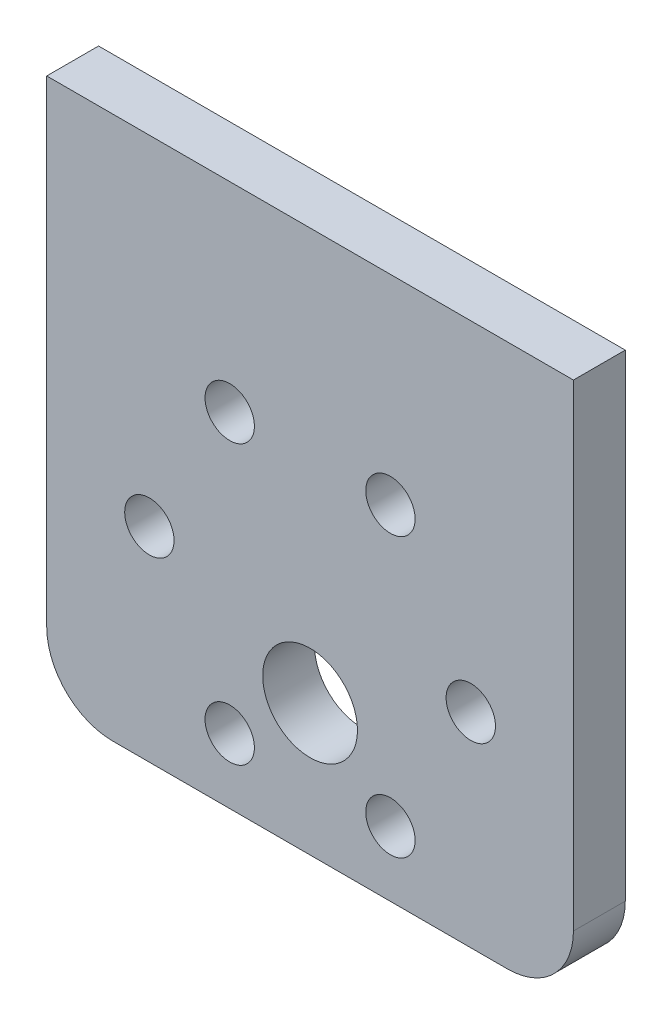
ISO-10303-21;
HEADER;
FILE_DESCRIPTION(('STEP AP214'),'2;1');
FILE_NAME('part.step','',(''),(''),'','','');
FILE_SCHEMA(('AUTOMOTIVE_DESIGN { 1 0 10303 214 1 1 1 1 }'));
ENDSEC;
DATA;
#1=APPLICATION_CONTEXT('core data for automotive mechanical design processes');
#2=APPLICATION_PROTOCOL_DEFINITION('international standard','automotive_design',2000,#1);
#3=PRODUCT_CONTEXT('',#1,'mechanical');
#4=PRODUCT('Part','Part','',(#3));
#5=PRODUCT_RELATED_PRODUCT_CATEGORY('part','',(#4));
#6=PRODUCT_DEFINITION_FORMATION('','',#4);
#7=PRODUCT_DEFINITION_CONTEXT('part definition',#1,'design');
#8=PRODUCT_DEFINITION('design','',#6,#7);
#9=PRODUCT_DEFINITION_SHAPE('','',#8);
#10=(LENGTH_UNIT() NAMED_UNIT(*) SI_UNIT(.MILLI.,.METRE.));
#11=(NAMED_UNIT(*) PLANE_ANGLE_UNIT() SI_UNIT($,.RADIAN.));
#12=(NAMED_UNIT(*) SI_UNIT($,.STERADIAN.) SOLID_ANGLE_UNIT());
#13=UNCERTAINTY_MEASURE_WITH_UNIT(LENGTH_MEASURE(1.E-05),#10,'distance_accuracy_value','');
#14=(GEOMETRIC_REPRESENTATION_CONTEXT(3) GLOBAL_UNCERTAINTY_ASSIGNED_CONTEXT((#13)) GLOBAL_UNIT_ASSIGNED_CONTEXT((#10,
#11,#12)) REPRESENTATION_CONTEXT('',''));
#15=CARTESIAN_POINT('',(0.,0.,0.));
#16=DIRECTION('',(0.,0.,1.));
#17=DIRECTION('',(1.,0.,0.));
#18=AXIS2_PLACEMENT_3D('',#15,#16,#17);
#19=CARTESIAN_POINT('',(0.,0.,-2.5));
#20=DIRECTION('',(0.,0.,-1.));
#21=DIRECTION('',(-1.,0.,0.));
#22=AXIS2_PLACEMENT_3D('',#19,#20,#21);
#23=PLANE('',#22);
#24=CARTESIAN_POINT('',(-15.5,-6.48740000000015,-2.5));
#25=DIRECTION('',(0.,0.,-1.));
#26=DIRECTION('',(-1.,0.,0.));
#27=AXIS2_PLACEMENT_3D('',#24,#25,#26);
#28=CIRCLE('',#27,2.38125);
#29=CARTESIAN_POINT('',(-17.88125,-6.48740000000015,-2.5));
#30=VERTEX_POINT('',#29);
#31=EDGE_CURVE('E209',#30,#30,#28,.T.);
#32=ORIENTED_EDGE('',*,*,#31,.F.);
#33=EDGE_LOOP('',(#32));
#34=FACE_BOUND('',#33,.T.);
#35=CARTESIAN_POINT('',(-7.75000000000013,6.93599375865875,-2.5));
#36=DIRECTION('',(0.,0.,-1.));
#37=DIRECTION('',(-1.,0.,0.));
#38=AXIS2_PLACEMENT_3D('',#35,#36,#37);
#39=CIRCLE('',#38,2.38125);
#40=CARTESIAN_POINT('',(-10.1312500000001,6.93599375865875,-2.5));
#41=VERTEX_POINT('',#40);
#42=EDGE_CURVE('E202',#41,#41,#39,.T.);
#43=ORIENTED_EDGE('',*,*,#42,.F.);
#44=EDGE_LOOP('',(#43));
#45=FACE_BOUND('',#44,.T.);
#46=CARTESIAN_POINT('',(7.75,6.93599375865881,-2.5));
#47=DIRECTION('',(0.,0.,-1.));
#48=DIRECTION('',(-1.,0.,0.));
#49=AXIS2_PLACEMENT_3D('',#46,#47,#48);
#50=CIRCLE('',#49,2.38125);
#51=CARTESIAN_POINT('',(5.36875,6.93599375865881,-2.5));
#52=VERTEX_POINT('',#51);
#53=EDGE_CURVE('E192',#52,#52,#50,.T.);
#54=ORIENTED_EDGE('',*,*,#53,.F.);
#55=EDGE_LOOP('',(#54));
#56=FACE_BOUND('',#55,.T.);
#57=CARTESIAN_POINT('',(15.5,-6.48739999999993,-2.5));
#58=DIRECTION('',(0.,0.,-1.));
#59=DIRECTION('',(-1.,0.,0.));
#60=AXIS2_PLACEMENT_3D('',#57,#58,#59);
#61=CIRCLE('',#60,2.38125);
#62=CARTESIAN_POINT('',(13.11875,-6.48739999999993,-2.5));
#63=VERTEX_POINT('',#62);
#64=EDGE_CURVE('E184',#63,#63,#61,.T.);
#65=ORIENTED_EDGE('',*,*,#64,.F.);
#66=EDGE_LOOP('',(#65));
#67=FACE_BOUND('',#66,.T.);
#68=CARTESIAN_POINT('',(-7.75000000000003,-19.9107937586588,-2.5));
#69=DIRECTION('',(0.,0.,-1.));
#70=DIRECTION('',(-1.,0.,0.));
#71=AXIS2_PLACEMENT_3D('',#68,#69,#70);
#72=CIRCLE('',#71,2.38125);
#73=CARTESIAN_POINT('',(-10.13125,-19.9107937586588,-2.5));
#74=VERTEX_POINT('',#73);
#75=EDGE_CURVE('E177',#74,#74,#72,.T.);
#76=ORIENTED_EDGE('',*,*,#75,.F.);
#77=EDGE_LOOP('',(#76));
#78=FACE_BOUND('',#77,.T.);
#79=CARTESIAN_POINT('',(7.75,-19.9107937586588,-2.5));
#80=DIRECTION('',(0.,0.,-1.));
#81=DIRECTION('',(-1.,0.,0.));
#82=AXIS2_PLACEMENT_3D('',#79,#80,#81);
#83=CIRCLE('',#82,2.38125);
#84=CARTESIAN_POINT('',(5.36875,-19.9107937586588,-2.5));
#85=VERTEX_POINT('',#84);
#86=EDGE_CURVE('E166',#85,#85,#83,.T.);
#87=ORIENTED_EDGE('',*,*,#86,.F.);
#88=EDGE_LOOP('',(#87));
#89=FACE_BOUND('',#88,.T.);
#90=DIRECTION('',(0.,1.,0.));
#91=VECTOR('',#90,1.);
#92=CARTESIAN_POINT('',(25.4,-26.1874,-2.5));
#93=LINE('',#92,#91);
#94=CARTESIAN_POINT('',(25.4,-19.8374,-2.5));
#95=VERTEX_POINT('',#94);
#96=CARTESIAN_POINT('',(25.4,26.1874,-2.5));
#97=VERTEX_POINT('',#96);
#98=EDGE_CURVE('E118',#95,#97,#93,.T.);
#99=ORIENTED_EDGE('',*,*,#98,.F.);
#100=CARTESIAN_POINT('',(19.05,-19.8374,-2.5));
#101=DIRECTION('',(0.,0.,-1.));
#102=DIRECTION('',(-1.,0.,0.));
#103=AXIS2_PLACEMENT_3D('',#100,#101,#102);
#104=CIRCLE('',#103,6.35);
#105=CARTESIAN_POINT('',(19.05,-26.1874,-2.5));
#106=VERTEX_POINT('',#105);
#107=EDGE_CURVE('E129',#95,#106,#104,.T.);
#108=ORIENTED_EDGE('',*,*,#107,.T.);
#109=DIRECTION('',(1.,0.,0.));
#110=VECTOR('',#109,1.);
#111=CARTESIAN_POINT('',(-25.4,-26.1874,-2.5));
#112=LINE('',#111,#110);
#113=CARTESIAN_POINT('',(-19.05,-26.1874,-2.5));
#114=VERTEX_POINT('',#113);
#115=EDGE_CURVE('E105',#114,#106,#112,.T.);
#116=ORIENTED_EDGE('',*,*,#115,.F.);
#117=CARTESIAN_POINT('',(-19.05,-19.8374,-2.5));
#118=DIRECTION('',(0.,0.,-1.));
#119=DIRECTION('',(-1.,0.,0.));
#120=AXIS2_PLACEMENT_3D('',#117,#118,#119);
#121=CIRCLE('',#120,6.35);
#122=CARTESIAN_POINT('',(-25.4,-19.8374,-2.5));
#123=VERTEX_POINT('',#122);
#124=EDGE_CURVE('E122',#114,#123,#121,.T.);
#125=ORIENTED_EDGE('',*,*,#124,.T.);
#126=DIRECTION('',(0.,-1.,0.));
#127=VECTOR('',#126,1.);
#128=CARTESIAN_POINT('',(-25.4,-26.1874,-2.5));
#129=LINE('',#128,#127);
#130=CARTESIAN_POINT('',(-25.4,26.1874,-2.5));
#131=VERTEX_POINT('',#130);
#132=EDGE_CURVE('E270',#131,#123,#129,.T.);
#133=ORIENTED_EDGE('',*,*,#132,.F.);
#134=DIRECTION('',(-1.,0.,0.));
#135=VECTOR('',#134,1.);
#136=CARTESIAN_POINT('',(-25.4,26.1874,-2.5));
#137=LINE('',#136,#135);
#138=EDGE_CURVE('E271',#97,#131,#137,.T.);
#139=ORIENTED_EDGE('',*,*,#138,.F.);
#140=EDGE_LOOP('',(#99,#108,#116,#125,#133,#139));
#141=FACE_BOUND('',#140,.T.);
#142=CARTESIAN_POINT('',(0.,-13.4874,-2.5));
#143=DIRECTION('',(0.,0.,1.));
#144=DIRECTION('',(1.,0.,0.));
#145=AXIS2_PLACEMENT_3D('',#142,#143,#144);
#146=CIRCLE('',#145,4.572);
#147=CARTESIAN_POINT('',(4.572,-13.4874,-2.5));
#148=VERTEX_POINT('',#147);
#149=EDGE_CURVE('E155',#148,#148,#146,.T.);
#150=ORIENTED_EDGE('',*,*,#149,.T.);
#151=EDGE_LOOP('',(#150));
#152=FACE_BOUND('',#151,.T.);
#153=ADVANCED_FACE('F40',(#34,#45,#56,#67,#78,#89,#141,#152),#23,.T.);
#154=CARTESIAN_POINT('',(25.4,-26.1874,2.5));
#155=DIRECTION('',(-1.,0.,0.));
#156=DIRECTION('',(0.,0.,1.));
#157=AXIS2_PLACEMENT_3D('',#154,#155,#156);
#158=PLANE('',#157);
#159=DIRECTION('',(0.,1.,0.));
#160=VECTOR('',#159,1.);
#161=CARTESIAN_POINT('',(25.4,-26.1874,2.5));
#162=LINE('',#161,#160);
#163=CARTESIAN_POINT('',(25.4,-19.8374,2.5));
#164=VERTEX_POINT('',#163);
#165=CARTESIAN_POINT('',(25.4,26.1874,2.5));
#166=VERTEX_POINT('',#165);
#167=EDGE_CURVE('E94',#164,#166,#162,.T.);
#168=ORIENTED_EDGE('',*,*,#167,.F.);
#169=DIRECTION('',(0.,0.,-1.));
#170=VECTOR('',#169,1.);
#171=CARTESIAN_POINT('',(25.4,-19.8374,2.5));
#172=LINE('',#171,#170);
#173=EDGE_CURVE('E120',#164,#95,#172,.T.);
#174=ORIENTED_EDGE('',*,*,#173,.T.);
#175=ORIENTED_EDGE('',*,*,#98,.T.);
#176=DIRECTION('',(0.,0.,-1.));
#177=VECTOR('',#176,1.);
#178=CARTESIAN_POINT('',(25.4,26.1874,2.5));
#179=LINE('',#178,#177);
#180=EDGE_CURVE('E110',#166,#97,#179,.T.);
#181=ORIENTED_EDGE('',*,*,#180,.F.);
#182=EDGE_LOOP('',(#168,#174,#175,#181));
#183=FACE_BOUND('',#182,.T.);
#184=ADVANCED_FACE('F116',(#183),#158,.F.);
#185=CARTESIAN_POINT('',(-25.4,26.1874,2.5));
#186=DIRECTION('',(0.,-1.,0.));
#187=DIRECTION('',(0.,0.,-1.));
#188=AXIS2_PLACEMENT_3D('',#185,#186,#187);
#189=PLANE('',#188);
#190=ORIENTED_EDGE('',*,*,#138,.T.);
#191=DIRECTION('',(0.,0.,-1.));
#192=VECTOR('',#191,1.);
#193=CARTESIAN_POINT('',(-25.4,26.1874,2.5));
#194=LINE('',#193,#192);
#195=CARTESIAN_POINT('',(-25.4,26.1874,2.5));
#196=VERTEX_POINT('',#195);
#197=EDGE_CURVE('E112',#196,#131,#194,.T.);
#198=ORIENTED_EDGE('',*,*,#197,.F.);
#199=DIRECTION('',(-1.,0.,0.));
#200=VECTOR('',#199,1.);
#201=CARTESIAN_POINT('',(-25.4,26.1874,2.5));
#202=LINE('',#201,#200);
#203=EDGE_CURVE('E97',#166,#196,#202,.T.);
#204=ORIENTED_EDGE('',*,*,#203,.F.);
#205=ORIENTED_EDGE('',*,*,#180,.T.);
#206=EDGE_LOOP('',(#190,#198,#204,#205));
#207=FACE_BOUND('',#206,.T.);
#208=ADVANCED_FACE('F109',(#207),#189,.F.);
#209=CARTESIAN_POINT('',(-25.4,-26.1874,2.5));
#210=DIRECTION('',(1.,0.,0.));
#211=DIRECTION('',(0.,0.,-1.));
#212=AXIS2_PLACEMENT_3D('',#209,#210,#211);
#213=PLANE('',#212);
#214=ORIENTED_EDGE('',*,*,#132,.T.);
#215=DIRECTION('',(0.,0.,-1.));
#216=VECTOR('',#215,1.);
#217=CARTESIAN_POINT('',(-25.4,-19.8374,2.5));
#218=LINE('',#217,#216);
#219=CARTESIAN_POINT('',(-25.4,-19.8374,2.5));
#220=VERTEX_POINT('',#219);
#221=EDGE_CURVE('E12',#123,#220,#218,.F.);
#222=ORIENTED_EDGE('',*,*,#221,.T.);
#223=DIRECTION('',(0.,-1.,0.));
#224=VECTOR('',#223,1.);
#225=CARTESIAN_POINT('',(-25.4,-26.1874,2.5));
#226=LINE('',#225,#224);
#227=EDGE_CURVE('E114',#196,#220,#226,.T.);
#228=ORIENTED_EDGE('',*,*,#227,.F.);
#229=ORIENTED_EDGE('',*,*,#197,.T.);
#230=EDGE_LOOP('',(#214,#222,#228,#229));
#231=FACE_BOUND('',#230,.T.);
#232=ADVANCED_FACE('F247',(#231),#213,.F.);
#233=CARTESIAN_POINT('',(-25.4,-26.1874,2.5));
#234=DIRECTION('',(0.,1.,0.));
#235=DIRECTION('',(0.,0.,1.));
#236=AXIS2_PLACEMENT_3D('',#233,#234,#235);
#237=PLANE('',#236);
#238=ORIENTED_EDGE('',*,*,#115,.T.);
#239=DIRECTION('',(0.,0.,-1.));
#240=VECTOR('',#239,1.);
#241=CARTESIAN_POINT('',(19.05,-26.1874,2.5));
#242=LINE('',#241,#240);
#243=CARTESIAN_POINT('',(19.05,-26.1874,2.5));
#244=VERTEX_POINT('',#243);
#245=EDGE_CURVE('E61',#106,#244,#242,.F.);
#246=ORIENTED_EDGE('',*,*,#245,.T.);
#247=DIRECTION('',(1.,0.,0.));
#248=VECTOR('',#247,1.);
#249=CARTESIAN_POINT('',(-25.4,-26.1874,2.5));
#250=LINE('',#249,#248);
#251=CARTESIAN_POINT('',(-19.05,-26.1874,2.5));
#252=VERTEX_POINT('',#251);
#253=EDGE_CURVE('E124',#252,#244,#250,.T.);
#254=ORIENTED_EDGE('',*,*,#253,.F.);
#255=DIRECTION('',(0.,0.,-1.));
#256=VECTOR('',#255,1.);
#257=CARTESIAN_POINT('',(-19.05,-26.1874,2.5));
#258=LINE('',#257,#256);
#259=EDGE_CURVE('E131',#252,#114,#258,.T.);
#260=ORIENTED_EDGE('',*,*,#259,.T.);
#261=EDGE_LOOP('',(#238,#246,#254,#260));
#262=FACE_BOUND('',#261,.T.);
#263=ADVANCED_FACE('F241',(#262),#237,.F.);
#264=CARTESIAN_POINT('',(0.,0.,2.5));
#265=DIRECTION('',(0.,0.,-1.));
#266=DIRECTION('',(-1.,0.,0.));
#267=AXIS2_PLACEMENT_3D('',#264,#265,#266);
#268=PLANE('',#267);
#269=CARTESIAN_POINT('',(-15.5,-6.48740000000015,2.5));
#270=DIRECTION('',(0.,0.,-1.));
#271=DIRECTION('',(-1.,0.,0.));
#272=AXIS2_PLACEMENT_3D('',#269,#270,#271);
#273=CIRCLE('',#272,2.38125);
#274=CARTESIAN_POINT('',(-17.88125,-6.48740000000015,2.5));
#275=VERTEX_POINT('',#274);
#276=EDGE_CURVE('E204',#275,#275,#273,.T.);
#277=ORIENTED_EDGE('',*,*,#276,.T.);
#278=EDGE_LOOP('',(#277));
#279=FACE_BOUND('',#278,.T.);
#280=CARTESIAN_POINT('',(-7.75000000000013,6.93599375865875,2.5));
#281=DIRECTION('',(0.,0.,-1.));
#282=DIRECTION('',(-1.,0.,0.));
#283=AXIS2_PLACEMENT_3D('',#280,#281,#282);
#284=CIRCLE('',#283,2.38125);
#285=CARTESIAN_POINT('',(-10.1312500000001,6.93599375865875,2.5));
#286=VERTEX_POINT('',#285);
#287=EDGE_CURVE('E197',#286,#286,#284,.T.);
#288=ORIENTED_EDGE('',*,*,#287,.T.);
#289=EDGE_LOOP('',(#288));
#290=FACE_BOUND('',#289,.T.);
#291=CARTESIAN_POINT('',(7.75,6.93599375865881,2.5));
#292=DIRECTION('',(0.,0.,-1.));
#293=DIRECTION('',(-1.,0.,0.));
#294=AXIS2_PLACEMENT_3D('',#291,#292,#293);
#295=CIRCLE('',#294,2.38125);
#296=CARTESIAN_POINT('',(5.36875,6.93599375865881,2.5));
#297=VERTEX_POINT('',#296);
#298=EDGE_CURVE('E187',#297,#297,#295,.T.);
#299=ORIENTED_EDGE('',*,*,#298,.T.);
#300=EDGE_LOOP('',(#299));
#301=FACE_BOUND('',#300,.T.);
#302=CARTESIAN_POINT('',(15.5,-6.48739999999993,2.5));
#303=DIRECTION('',(0.,0.,-1.));
#304=DIRECTION('',(-1.,0.,0.));
#305=AXIS2_PLACEMENT_3D('',#302,#303,#304);
#306=CIRCLE('',#305,2.38125);
#307=CARTESIAN_POINT('',(13.11875,-6.48739999999993,2.5));
#308=VERTEX_POINT('',#307);
#309=EDGE_CURVE('E179',#308,#308,#306,.T.);
#310=ORIENTED_EDGE('',*,*,#309,.T.);
#311=EDGE_LOOP('',(#310));
#312=FACE_BOUND('',#311,.T.);
#313=CARTESIAN_POINT('',(-7.75000000000003,-19.9107937586588,2.5));
#314=DIRECTION('',(0.,0.,-1.));
#315=DIRECTION('',(-1.,0.,0.));
#316=AXIS2_PLACEMENT_3D('',#313,#314,#315);
#317=CIRCLE('',#316,2.38125);
#318=CARTESIAN_POINT('',(-10.13125,-19.9107937586588,2.5));
#319=VERTEX_POINT('',#318);
#320=EDGE_CURVE('E172',#319,#319,#317,.T.);
#321=ORIENTED_EDGE('',*,*,#320,.T.);
#322=EDGE_LOOP('',(#321));
#323=FACE_BOUND('',#322,.T.);
#324=CARTESIAN_POINT('',(7.75,-19.9107937586588,2.5));
#325=DIRECTION('',(0.,0.,-1.));
#326=DIRECTION('',(-1.,0.,0.));
#327=AXIS2_PLACEMENT_3D('',#324,#325,#326);
#328=CIRCLE('',#327,2.38125);
#329=CARTESIAN_POINT('',(5.36875,-19.9107937586588,2.5));
#330=VERTEX_POINT('',#329);
#331=EDGE_CURVE('E161',#330,#330,#328,.T.);
#332=ORIENTED_EDGE('',*,*,#331,.T.);
#333=EDGE_LOOP('',(#332));
#334=FACE_BOUND('',#333,.T.);
#335=CARTESIAN_POINT('',(0.,-13.4874,2.5));
#336=DIRECTION('',(0.,0.,1.));
#337=DIRECTION('',(1.,0.,0.));
#338=AXIS2_PLACEMENT_3D('',#335,#336,#337);
#339=CIRCLE('',#338,4.572);
#340=CARTESIAN_POINT('',(4.572,-13.4874,2.5));
#341=VERTEX_POINT('',#340);
#342=EDGE_CURVE('E157',#341,#341,#339,.T.);
#343=ORIENTED_EDGE('',*,*,#342,.F.);
#344=EDGE_LOOP('',(#343));
#345=FACE_BOUND('',#344,.T.);
#346=ORIENTED_EDGE('',*,*,#253,.T.);
#347=CARTESIAN_POINT('',(19.05,-19.8374,2.5));
#348=DIRECTION('',(0.,0.,-1.));
#349=DIRECTION('',(-1.,0.,0.));
#350=AXIS2_PLACEMENT_3D('',#347,#348,#349);
#351=CIRCLE('',#350,6.35);
#352=EDGE_CURVE('E48',#244,#164,#351,.F.);
#353=ORIENTED_EDGE('',*,*,#352,.T.);
#354=ORIENTED_EDGE('',*,*,#167,.T.);
#355=ORIENTED_EDGE('',*,*,#203,.T.);
#356=ORIENTED_EDGE('',*,*,#227,.T.);
#357=CARTESIAN_POINT('',(-19.05,-19.8374,2.5));
#358=DIRECTION('',(0.,0.,-1.));
#359=DIRECTION('',(-1.,0.,0.));
#360=AXIS2_PLACEMENT_3D('',#357,#358,#359);
#361=CIRCLE('',#360,6.35);
#362=EDGE_CURVE('E135',#220,#252,#361,.F.);
#363=ORIENTED_EDGE('',*,*,#362,.T.);
#364=EDGE_LOOP('',(#346,#353,#354,#355,#356,#363));
#365=FACE_BOUND('',#364,.T.);
#366=ADVANCED_FACE('F96',(#279,#290,#301,#312,#323,#334,#345,#365),#268,.F.);
#367=CARTESIAN_POINT('',(0.,-13.4874,2.5));
#368=DIRECTION('',(0.,0.,1.));
#369=DIRECTION('',(1.,0.,0.));
#370=AXIS2_PLACEMENT_3D('',#367,#368,#369);
#371=CYLINDRICAL_SURFACE('',#370,4.572);
#372=ORIENTED_EDGE('',*,*,#149,.F.);
#373=EDGE_LOOP('',(#372));
#374=FACE_BOUND('',#373,.T.);
#375=ORIENTED_EDGE('',*,*,#342,.T.);
#376=EDGE_LOOP('',(#375));
#377=FACE_BOUND('',#376,.T.);
#378=ADVANCED_FACE('F233',(#374,#377),#371,.F.);
#379=CARTESIAN_POINT('',(7.75,-19.9107937586588,-2.5));
#380=DIRECTION('',(0.,0.,-1.));
#381=DIRECTION('',(-1.,0.,0.));
#382=AXIS2_PLACEMENT_3D('',#379,#380,#381);
#383=CYLINDRICAL_SURFACE('',#382,2.38125);
#384=ORIENTED_EDGE('',*,*,#331,.F.);
#385=EDGE_LOOP('',(#384));
#386=FACE_BOUND('',#385,.T.);
#387=ORIENTED_EDGE('',*,*,#86,.T.);
#388=EDGE_LOOP('',(#387));
#389=FACE_BOUND('',#388,.T.);
#390=ADVANCED_FACE('F236',(#386,#389),#383,.F.);
#391=CARTESIAN_POINT('',(-7.75000000000003,-19.9107937586588,-2.5));
#392=DIRECTION('',(0.,0.,-1.));
#393=DIRECTION('',(-1.,0.,0.));
#394=AXIS2_PLACEMENT_3D('',#391,#392,#393);
#395=CYLINDRICAL_SURFACE('',#394,2.38125);
#396=ORIENTED_EDGE('',*,*,#320,.F.);
#397=EDGE_LOOP('',(#396));
#398=FACE_BOUND('',#397,.T.);
#399=ORIENTED_EDGE('',*,*,#75,.T.);
#400=EDGE_LOOP('',(#399));
#401=FACE_BOUND('',#400,.T.);
#402=ADVANCED_FACE('F288',(#398,#401),#395,.F.);
#403=CARTESIAN_POINT('',(15.5,-6.48739999999993,-2.5));
#404=DIRECTION('',(0.,0.,-1.));
#405=DIRECTION('',(-1.,0.,0.));
#406=AXIS2_PLACEMENT_3D('',#403,#404,#405);
#407=CYLINDRICAL_SURFACE('',#406,2.38125);
#408=ORIENTED_EDGE('',*,*,#309,.F.);
#409=EDGE_LOOP('',(#408));
#410=FACE_BOUND('',#409,.T.);
#411=ORIENTED_EDGE('',*,*,#64,.T.);
#412=EDGE_LOOP('',(#411));
#413=FACE_BOUND('',#412,.T.);
#414=ADVANCED_FACE('F284',(#410,#413),#407,.F.);
#415=CARTESIAN_POINT('',(7.75,6.93599375865881,-2.5));
#416=DIRECTION('',(0.,0.,-1.));
#417=DIRECTION('',(-1.,0.,0.));
#418=AXIS2_PLACEMENT_3D('',#415,#416,#417);
#419=CYLINDRICAL_SURFACE('',#418,2.38125);
#420=ORIENTED_EDGE('',*,*,#298,.F.);
#421=EDGE_LOOP('',(#420));
#422=FACE_BOUND('',#421,.T.);
#423=ORIENTED_EDGE('',*,*,#53,.T.);
#424=EDGE_LOOP('',(#423));
#425=FACE_BOUND('',#424,.T.);
#426=ADVANCED_FACE('F277',(#422,#425),#419,.F.);
#427=CARTESIAN_POINT('',(-7.75000000000013,6.93599375865875,-2.5));
#428=DIRECTION('',(0.,0.,-1.));
#429=DIRECTION('',(-1.,0.,0.));
#430=AXIS2_PLACEMENT_3D('',#427,#428,#429);
#431=CYLINDRICAL_SURFACE('',#430,2.38125);
#432=ORIENTED_EDGE('',*,*,#287,.F.);
#433=EDGE_LOOP('',(#432));
#434=FACE_BOUND('',#433,.T.);
#435=ORIENTED_EDGE('',*,*,#42,.T.);
#436=EDGE_LOOP('',(#435));
#437=FACE_BOUND('',#436,.T.);
#438=ADVANCED_FACE('F265',(#434,#437),#431,.F.);
#439=CARTESIAN_POINT('',(-15.5,-6.48740000000015,-2.5));
#440=DIRECTION('',(0.,0.,-1.));
#441=DIRECTION('',(-1.,0.,0.));
#442=AXIS2_PLACEMENT_3D('',#439,#440,#441);
#443=CYLINDRICAL_SURFACE('',#442,2.38125);
#444=ORIENTED_EDGE('',*,*,#276,.F.);
#445=EDGE_LOOP('',(#444));
#446=FACE_BOUND('',#445,.T.);
#447=ORIENTED_EDGE('',*,*,#31,.T.);
#448=EDGE_LOOP('',(#447));
#449=FACE_BOUND('',#448,.T.);
#450=ADVANCED_FACE('F213',(#446,#449),#443,.F.);
#451=CARTESIAN_POINT('',(19.05,-19.8374,2.5));
#452=DIRECTION('',(0.,0.,-1.));
#453=DIRECTION('',(-1.,0.,0.));
#454=AXIS2_PLACEMENT_3D('',#451,#452,#453);
#455=CYLINDRICAL_SURFACE('',#454,6.35);
#456=ORIENTED_EDGE('',*,*,#352,.F.);
#457=ORIENTED_EDGE('',*,*,#245,.F.);
#458=ORIENTED_EDGE('',*,*,#107,.F.);
#459=ORIENTED_EDGE('',*,*,#173,.F.);
#460=EDGE_LOOP('',(#456,#457,#458,#459));
#461=FACE_BOUND('',#460,.T.);
#462=ADVANCED_FACE('F257',(#461),#455,.T.);
#463=CARTESIAN_POINT('',(-19.05,-19.8374,2.5));
#464=DIRECTION('',(0.,0.,-1.));
#465=DIRECTION('',(-1.,0.,0.));
#466=AXIS2_PLACEMENT_3D('',#463,#464,#465);
#467=CYLINDRICAL_SURFACE('',#466,6.35);
#468=ORIENTED_EDGE('',*,*,#362,.F.);
#469=ORIENTED_EDGE('',*,*,#221,.F.);
#470=ORIENTED_EDGE('',*,*,#124,.F.);
#471=ORIENTED_EDGE('',*,*,#259,.F.);
#472=EDGE_LOOP('',(#468,#469,#470,#471));
#473=FACE_BOUND('',#472,.T.);
#474=ADVANCED_FACE('F42',(#473),#467,.T.);
#475=CLOSED_SHELL('',(#153,#184,#208,#232,#263,#366,#378,#390,#402,#414,#426,#438,#450,#462,#474));
#476=MANIFOLD_SOLID_BREP('B2',#475);
#477=ADVANCED_BREP_SHAPE_REPRESENTATION('',(#18,#476),#14);
#478=SHAPE_DEFINITION_REPRESENTATION(#9,#477);
ENDSEC;
END-ISO-10303-21;
